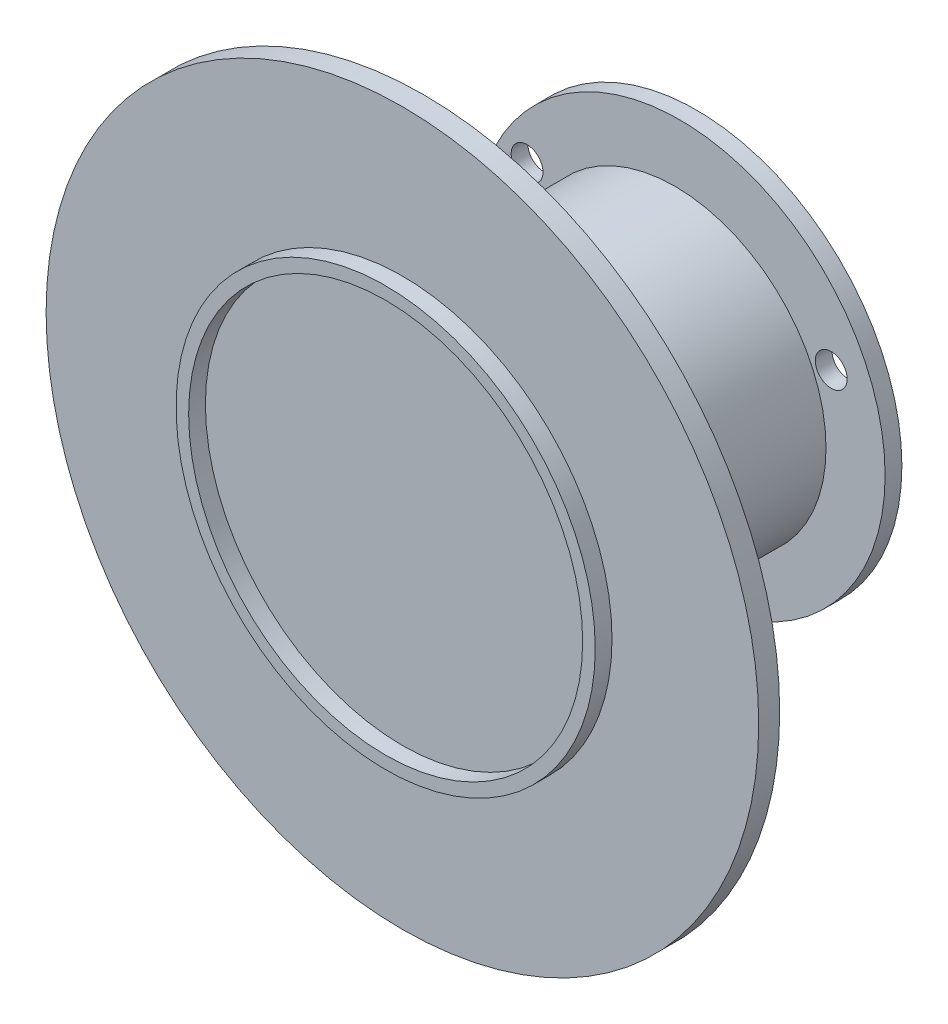
ISO-10303-21;
HEADER;
FILE_DESCRIPTION(('STEP AP214'),'2;1');
FILE_NAME('part.step','',(''),(''),'','','');
FILE_SCHEMA(('AUTOMOTIVE_DESIGN { 1 0 10303 214 1 1 1 1 }'));
ENDSEC;
DATA;
#1=APPLICATION_CONTEXT('core data for automotive mechanical design processes');
#2=APPLICATION_PROTOCOL_DEFINITION('international standard','automotive_design',2000,#1);
#3=PRODUCT_CONTEXT('',#1,'mechanical');
#4=PRODUCT('Part','Part','',(#3));
#5=PRODUCT_RELATED_PRODUCT_CATEGORY('part','',(#4));
#6=PRODUCT_DEFINITION_FORMATION('','',#4);
#7=PRODUCT_DEFINITION_CONTEXT('part definition',#1,'design');
#8=PRODUCT_DEFINITION('design','',#6,#7);
#9=PRODUCT_DEFINITION_SHAPE('','',#8);
#10=(LENGTH_UNIT() NAMED_UNIT(*) SI_UNIT(.MILLI.,.METRE.));
#11=(NAMED_UNIT(*) PLANE_ANGLE_UNIT() SI_UNIT($,.RADIAN.));
#12=(NAMED_UNIT(*) SI_UNIT($,.STERADIAN.) SOLID_ANGLE_UNIT());
#13=UNCERTAINTY_MEASURE_WITH_UNIT(LENGTH_MEASURE(1.E-05),#10,'distance_accuracy_value','');
#14=(GEOMETRIC_REPRESENTATION_CONTEXT(3) GLOBAL_UNCERTAINTY_ASSIGNED_CONTEXT((#13)) GLOBAL_UNIT_ASSIGNED_CONTEXT((#10,
#11,#12)) REPRESENTATION_CONTEXT('',''));
#15=CARTESIAN_POINT('',(0.,0.,0.));
#16=DIRECTION('',(0.,0.,1.));
#17=DIRECTION('',(1.,0.,0.));
#18=AXIS2_PLACEMENT_3D('',#15,#16,#17);
#19=CARTESIAN_POINT('',(4.32588205727847,117.21992017466,2.));
#20=DIRECTION('',(0.,0.,-1.));
#21=DIRECTION('',(-1.,0.,0.));
#22=AXIS2_PLACEMENT_3D('',#19,#20,#21);
#23=CYLINDRICAL_SURFACE('',#22,24.5);
#24=CARTESIAN_POINT('',(4.32588205727847,117.21992017466,2.));
#25=DIRECTION('',(0.,0.,1.));
#26=DIRECTION('',(1.,0.,0.));
#27=AXIS2_PLACEMENT_3D('',#24,#25,#26);
#28=CIRCLE('',#27,24.5);
#29=CARTESIAN_POINT('',(28.8258820572785,117.21992017466,2.));
#30=VERTEX_POINT('',#29);
#31=EDGE_CURVE('E53',#30,#30,#28,.T.);
#32=ORIENTED_EDGE('',*,*,#31,.F.);
#33=EDGE_LOOP('',(#32));
#34=FACE_BOUND('',#33,.T.);
#35=CARTESIAN_POINT('',(4.32588205727847,117.21992017466,0.));
#36=DIRECTION('',(0.,0.,1.));
#37=DIRECTION('',(1.,0.,0.));
#38=AXIS2_PLACEMENT_3D('',#35,#36,#37);
#39=CIRCLE('',#38,24.5);
#40=CARTESIAN_POINT('',(28.8258820572785,117.21992017466,0.));
#41=VERTEX_POINT('',#40);
#42=EDGE_CURVE('E84',#41,#41,#39,.T.);
#43=ORIENTED_EDGE('',*,*,#42,.T.);
#44=EDGE_LOOP('',(#43));
#45=FACE_BOUND('',#44,.T.);
#46=ADVANCED_FACE('F41',(#34,#45),#23,.T.);
#47=CARTESIAN_POINT('',(4.32588205727847,117.21992017466,2.));
#48=DIRECTION('',(0.,0.,1.));
#49=DIRECTION('',(1.,0.,0.));
#50=AXIS2_PLACEMENT_3D('',#47,#48,#49);
#51=PLANE('',#50);
#52=CARTESIAN_POINT('',(3.74956552877071,116.532687920295,2.));
#53=DIRECTION('',(0.,0.,1.));
#54=DIRECTION('',(1.,0.,0.));
#55=AXIS2_PLACEMENT_3D('',#52,#53,#54);
#56=CIRCLE('',#55,18.0267627530498);
#57=CARTESIAN_POINT('',(21.7763282818206,116.532687920295,2.));
#58=VERTEX_POINT('',#57);
#59=EDGE_CURVE('E48',#58,#58,#56,.T.);
#60=ORIENTED_EDGE('',*,*,#59,.F.);
#61=EDGE_LOOP('',(#60));
#62=FACE_BOUND('',#61,.T.);
#63=CARTESIAN_POINT('',(1.17900836765727,95.8964392463386,2.));
#64=DIRECTION('',(0.,0.,1.));
#65=DIRECTION('',(1.,0.,0.));
#66=AXIS2_PLACEMENT_3D('',#63,#64,#65);
#67=CIRCLE('',#66,1.9);
#68=CARTESIAN_POINT('',(3.07900836765727,95.8964392463386,2.));
#69=VERTEX_POINT('',#68);
#70=EDGE_CURVE('E67',#69,#69,#67,.T.);
#71=ORIENTED_EDGE('',*,*,#70,.F.);
#72=EDGE_LOOP('',(#71));
#73=FACE_BOUND('',#72,.T.);
#74=CARTESIAN_POINT('',(22.395703108657,124.906718795565,2.));
#75=DIRECTION('',(0.,0.,1.));
#76=DIRECTION('',(1.,0.,0.));
#77=AXIS2_PLACEMENT_3D('',#74,#75,#76);
#78=CIRCLE('',#77,1.9);
#79=CARTESIAN_POINT('',(24.295703108657,124.906718795565,2.));
#80=VERTEX_POINT('',#79);
#81=EDGE_CURVE('E73',#80,#80,#78,.T.);
#82=ORIENTED_EDGE('',*,*,#81,.F.);
#83=EDGE_LOOP('',(#82));
#84=FACE_BOUND('',#83,.T.);
#85=CARTESIAN_POINT('',(-13.8821185720653,128.141421182327,2.));
#86=DIRECTION('',(0.,0.,1.));
#87=DIRECTION('',(1.,0.,0.));
#88=AXIS2_PLACEMENT_3D('',#85,#86,#87);
#89=CIRCLE('',#88,1.9);
#90=CARTESIAN_POINT('',(-11.9821185720653,128.141421182327,2.));
#91=VERTEX_POINT('',#90);
#92=EDGE_CURVE('E70',#91,#91,#89,.T.);
#93=ORIENTED_EDGE('',*,*,#92,.F.);
#94=EDGE_LOOP('',(#93));
#95=FACE_BOUND('',#94,.T.);
#96=ORIENTED_EDGE('',*,*,#31,.T.);
#97=EDGE_LOOP('',(#96));
#98=FACE_BOUND('',#97,.T.);
#99=ADVANCED_FACE('F112',(#62,#73,#84,#95,#98),#51,.T.);
#100=CARTESIAN_POINT('',(4.32588205727847,117.21992017466,0.));
#101=DIRECTION('',(0.,0.,1.));
#102=DIRECTION('',(1.,0.,0.));
#103=AXIS2_PLACEMENT_3D('',#100,#101,#102);
#104=PLANE('',#103);
#105=CARTESIAN_POINT('',(1.17900836765727,95.8964392463386,0.));
#106=DIRECTION('',(0.,0.,1.));
#107=DIRECTION('',(1.,0.,0.));
#108=AXIS2_PLACEMENT_3D('',#105,#106,#107);
#109=CIRCLE('',#108,1.9);
#110=CARTESIAN_POINT('',(3.07900836765727,95.8964392463386,0.));
#111=VERTEX_POINT('',#110);
#112=EDGE_CURVE('E42',#111,#111,#109,.T.);
#113=ORIENTED_EDGE('',*,*,#112,.T.);
#114=EDGE_LOOP('',(#113));
#115=FACE_BOUND('',#114,.T.);
#116=CARTESIAN_POINT('',(22.395703108657,124.906718795565,0.));
#117=DIRECTION('',(0.,0.,1.));
#118=DIRECTION('',(1.,0.,0.));
#119=AXIS2_PLACEMENT_3D('',#116,#117,#118);
#120=CIRCLE('',#119,1.9);
#121=CARTESIAN_POINT('',(24.295703108657,124.906718795565,0.));
#122=VERTEX_POINT('',#121);
#123=EDGE_CURVE('E86',#122,#122,#120,.T.);
#124=ORIENTED_EDGE('',*,*,#123,.T.);
#125=EDGE_LOOP('',(#124));
#126=FACE_BOUND('',#125,.T.);
#127=CARTESIAN_POINT('',(-13.8821185720653,128.141421182327,0.));
#128=DIRECTION('',(0.,0.,1.));
#129=DIRECTION('',(1.,0.,0.));
#130=AXIS2_PLACEMENT_3D('',#127,#128,#129);
#131=CIRCLE('',#130,1.9);
#132=CARTESIAN_POINT('',(-11.9821185720653,128.141421182327,0.));
#133=VERTEX_POINT('',#132);
#134=EDGE_CURVE('E71',#133,#133,#131,.T.);
#135=ORIENTED_EDGE('',*,*,#134,.T.);
#136=EDGE_LOOP('',(#135));
#137=FACE_BOUND('',#136,.T.);
#138=ORIENTED_EDGE('',*,*,#42,.F.);
#139=EDGE_LOOP('',(#138));
#140=FACE_BOUND('',#139,.T.);
#141=ADVANCED_FACE('F91',(#115,#126,#137,#140),#104,.F.);
#142=CARTESIAN_POINT('',(-13.8821185720653,128.141421182327,-1.));
#143=DIRECTION('',(0.,0.,1.));
#144=DIRECTION('',(1.,0.,0.));
#145=AXIS2_PLACEMENT_3D('',#142,#143,#144);
#146=CYLINDRICAL_SURFACE('',#145,1.9);
#147=ORIENTED_EDGE('',*,*,#92,.T.);
#148=EDGE_LOOP('',(#147));
#149=FACE_BOUND('',#148,.T.);
#150=ORIENTED_EDGE('',*,*,#134,.F.);
#151=EDGE_LOOP('',(#150));
#152=FACE_BOUND('',#151,.T.);
#153=ADVANCED_FACE('F111',(#149,#152),#146,.F.);
#154=CARTESIAN_POINT('',(22.395703108657,124.906718795565,-1.));
#155=DIRECTION('',(0.,0.,1.));
#156=DIRECTION('',(1.,0.,0.));
#157=AXIS2_PLACEMENT_3D('',#154,#155,#156);
#158=CYLINDRICAL_SURFACE('',#157,1.9);
#159=ORIENTED_EDGE('',*,*,#81,.T.);
#160=EDGE_LOOP('',(#159));
#161=FACE_BOUND('',#160,.T.);
#162=ORIENTED_EDGE('',*,*,#123,.F.);
#163=EDGE_LOOP('',(#162));
#164=FACE_BOUND('',#163,.T.);
#165=ADVANCED_FACE('F100',(#161,#164),#158,.F.);
#166=CARTESIAN_POINT('',(1.17900836765727,95.8964392463386,-1.));
#167=DIRECTION('',(0.,0.,1.));
#168=DIRECTION('',(1.,0.,0.));
#169=AXIS2_PLACEMENT_3D('',#166,#167,#168);
#170=CYLINDRICAL_SURFACE('',#169,1.9);
#171=ORIENTED_EDGE('',*,*,#70,.T.);
#172=EDGE_LOOP('',(#171));
#173=FACE_BOUND('',#172,.T.);
#174=ORIENTED_EDGE('',*,*,#112,.F.);
#175=EDGE_LOOP('',(#174));
#176=FACE_BOUND('',#175,.T.);
#177=ADVANCED_FACE('F98',(#173,#176),#170,.F.);
#178=CARTESIAN_POINT('',(3.74956552877071,116.532687920295,32.));
#179=DIRECTION('',(0.,0.,-1.));
#180=DIRECTION('',(-1.,0.,0.));
#181=AXIS2_PLACEMENT_3D('',#178,#179,#180);
#182=CYLINDRICAL_SURFACE('',#181,18.0267627530498);
#183=CARTESIAN_POINT('',(3.74956552877071,116.532687920295,32.));
#184=DIRECTION('',(0.,0.,1.));
#185=DIRECTION('',(1.,0.,0.));
#186=AXIS2_PLACEMENT_3D('',#183,#184,#185);
#187=CIRCLE('',#186,18.0267627530498);
#188=CARTESIAN_POINT('',(21.7763282818206,116.532687920295,32.));
#189=VERTEX_POINT('',#188);
#190=EDGE_CURVE('E64',#189,#189,#187,.T.);
#191=ORIENTED_EDGE('',*,*,#190,.F.);
#192=EDGE_LOOP('',(#191));
#193=FACE_BOUND('',#192,.T.);
#194=ORIENTED_EDGE('',*,*,#59,.T.);
#195=EDGE_LOOP('',(#194));
#196=FACE_BOUND('',#195,.T.);
#197=ADVANCED_FACE('F96',(#193,#196),#182,.T.);
#198=CARTESIAN_POINT('',(3.74956552877071,116.532687920295,34.5));
#199=DIRECTION('',(0.,0.,-1.));
#200=DIRECTION('',(-1.,0.,0.));
#201=AXIS2_PLACEMENT_3D('',#198,#199,#200);
#202=CYLINDRICAL_SURFACE('',#201,42.5);
#203=CARTESIAN_POINT('',(3.74956552877071,116.532687920295,34.5));
#204=DIRECTION('',(0.,0.,1.));
#205=DIRECTION('',(1.,0.,0.));
#206=AXIS2_PLACEMENT_3D('',#203,#204,#205);
#207=CIRCLE('',#206,42.5);
#208=CARTESIAN_POINT('',(46.2495655287707,116.532687920295,34.5));
#209=VERTEX_POINT('',#208);
#210=EDGE_CURVE('E58',#209,#209,#207,.T.);
#211=ORIENTED_EDGE('',*,*,#210,.F.);
#212=EDGE_LOOP('',(#211));
#213=FACE_BOUND('',#212,.T.);
#214=CARTESIAN_POINT('',(3.74956552877071,116.532687920295,32.));
#215=DIRECTION('',(0.,0.,1.));
#216=DIRECTION('',(1.,0.,0.));
#217=AXIS2_PLACEMENT_3D('',#214,#215,#216);
#218=CIRCLE('',#217,42.5);
#219=CARTESIAN_POINT('',(46.2495655287707,116.532687920295,32.));
#220=VERTEX_POINT('',#219);
#221=EDGE_CURVE('E61',#220,#220,#218,.T.);
#222=ORIENTED_EDGE('',*,*,#221,.T.);
#223=EDGE_LOOP('',(#222));
#224=FACE_BOUND('',#223,.T.);
#225=ADVANCED_FACE('F110',(#213,#224),#202,.T.);
#226=CARTESIAN_POINT('',(3.74956552877071,116.532687920295,34.5));
#227=DIRECTION('',(0.,0.,1.));
#228=DIRECTION('',(1.,0.,0.));
#229=AXIS2_PLACEMENT_3D('',#226,#227,#228);
#230=PLANE('',#229);
#231=CARTESIAN_POINT('',(3.7495655287707,116.532687920295,34.5));
#232=DIRECTION('',(0.,0.,1.));
#233=DIRECTION('',(1.,0.,0.));
#234=AXIS2_PLACEMENT_3D('',#231,#232,#233);
#235=CIRCLE('',#234,25.);
#236=CARTESIAN_POINT('',(28.7495655287707,116.532687920295,34.5));
#237=VERTEX_POINT('',#236);
#238=EDGE_CURVE('E10',#237,#237,#235,.T.);
#239=ORIENTED_EDGE('',*,*,#238,.F.);
#240=EDGE_LOOP('',(#239));
#241=FACE_BOUND('',#240,.T.);
#242=ORIENTED_EDGE('',*,*,#210,.T.);
#243=EDGE_LOOP('',(#242));
#244=FACE_BOUND('',#243,.T.);
#245=ADVANCED_FACE('F166',(#241,#244),#230,.T.);
#246=CARTESIAN_POINT('',(3.74956552877071,116.532687920295,32.));
#247=DIRECTION('',(0.,0.,1.));
#248=DIRECTION('',(1.,0.,0.));
#249=AXIS2_PLACEMENT_3D('',#246,#247,#248);
#250=PLANE('',#249);
#251=ORIENTED_EDGE('',*,*,#190,.T.);
#252=EDGE_LOOP('',(#251));
#253=FACE_BOUND('',#252,.T.);
#254=ORIENTED_EDGE('',*,*,#221,.F.);
#255=EDGE_LOOP('',(#254));
#256=FACE_BOUND('',#255,.T.);
#257=ADVANCED_FACE('F174',(#253,#256),#250,.F.);
#258=CARTESIAN_POINT('',(3.7495655287707,116.532687920295,36.5));
#259=DIRECTION('',(0.,0.,1.));
#260=DIRECTION('',(1.,0.,0.));
#261=AXIS2_PLACEMENT_3D('',#258,#259,#260);
#262=PLANE('',#261);
#263=CARTESIAN_POINT('',(3.7495655287707,116.532687920295,36.5));
#264=DIRECTION('',(0.,0.,1.));
#265=DIRECTION('',(1.,0.,0.));
#266=AXIS2_PLACEMENT_3D('',#263,#264,#265);
#267=CIRCLE('',#266,25.);
#268=CARTESIAN_POINT('',(28.7495655287707,116.532687920295,36.5));
#269=VERTEX_POINT('',#268);
#270=EDGE_CURVE('E59',#269,#269,#267,.T.);
#271=ORIENTED_EDGE('',*,*,#270,.T.);
#272=EDGE_LOOP('',(#271));
#273=FACE_BOUND('',#272,.T.);
#274=CARTESIAN_POINT('',(3.7495655287707,116.532687920295,36.5));
#275=DIRECTION('',(0.,0.,1.));
#276=DIRECTION('',(1.,0.,0.));
#277=AXIS2_PLACEMENT_3D('',#274,#275,#276);
#278=CIRCLE('',#277,23.5);
#279=CARTESIAN_POINT('',(27.2495655287707,116.532687920295,36.5));
#280=VERTEX_POINT('',#279);
#281=EDGE_CURVE('E253',#280,#280,#278,.T.);
#282=ORIENTED_EDGE('',*,*,#281,.F.);
#283=EDGE_LOOP('',(#282));
#284=FACE_BOUND('',#283,.T.);
#285=ADVANCED_FACE('F177',(#273,#284),#262,.T.);
#286=CARTESIAN_POINT('',(3.7495655287707,116.532687920295,36.5));
#287=DIRECTION('',(0.,0.,-1.));
#288=DIRECTION('',(-1.,0.,0.));
#289=AXIS2_PLACEMENT_3D('',#286,#287,#288);
#290=CYLINDRICAL_SURFACE('',#289,25.);
#291=ORIENTED_EDGE('',*,*,#270,.F.);
#292=EDGE_LOOP('',(#291));
#293=FACE_BOUND('',#292,.T.);
#294=ORIENTED_EDGE('',*,*,#238,.T.);
#295=EDGE_LOOP('',(#294));
#296=FACE_BOUND('',#295,.T.);
#297=ADVANCED_FACE('F196',(#293,#296),#290,.T.);
#298=CARTESIAN_POINT('',(3.7495655287707,116.532687920295,36.5));
#299=DIRECTION('',(0.,0.,-1.));
#300=DIRECTION('',(-1.,0.,0.));
#301=AXIS2_PLACEMENT_3D('',#298,#299,#300);
#302=CYLINDRICAL_SURFACE('',#301,23.5);
#303=ORIENTED_EDGE('',*,*,#281,.T.);
#304=EDGE_LOOP('',(#303));
#305=FACE_BOUND('',#304,.T.);
#306=CARTESIAN_POINT('',(3.7495655287707,116.532687920295,34.5));
#307=DIRECTION('',(0.,0.,1.));
#308=DIRECTION('',(1.,0.,0.));
#309=AXIS2_PLACEMENT_3D('',#306,#307,#308);
#310=CIRCLE('',#309,23.5);
#311=CARTESIAN_POINT('',(27.2495655287707,116.532687920295,34.5));
#312=VERTEX_POINT('',#311);
#313=EDGE_CURVE('E254',#312,#312,#310,.T.);
#314=ORIENTED_EDGE('',*,*,#313,.F.);
#315=EDGE_LOOP('',(#314));
#316=FACE_BOUND('',#315,.T.);
#317=ADVANCED_FACE('F207',(#305,#316),#302,.F.);
#318=ORIENTED_EDGE('',*,*,#313,.T.);
#319=EDGE_LOOP('',(#318));
#320=FACE_BOUND('',#319,.T.);
#321=ADVANCED_FACE('F188',(#320),#230,.T.);
#322=CLOSED_SHELL('',(#46,#99,#141,#153,#165,#177,#197,#225,#245,#257,#285,#297,#317,#321));
#323=MANIFOLD_SOLID_BREP('B2',#322);
#324=ADVANCED_BREP_SHAPE_REPRESENTATION('',(#18,#323),#14);
#325=SHAPE_DEFINITION_REPRESENTATION(#9,#324);
ENDSEC;
END-ISO-10303-21;
